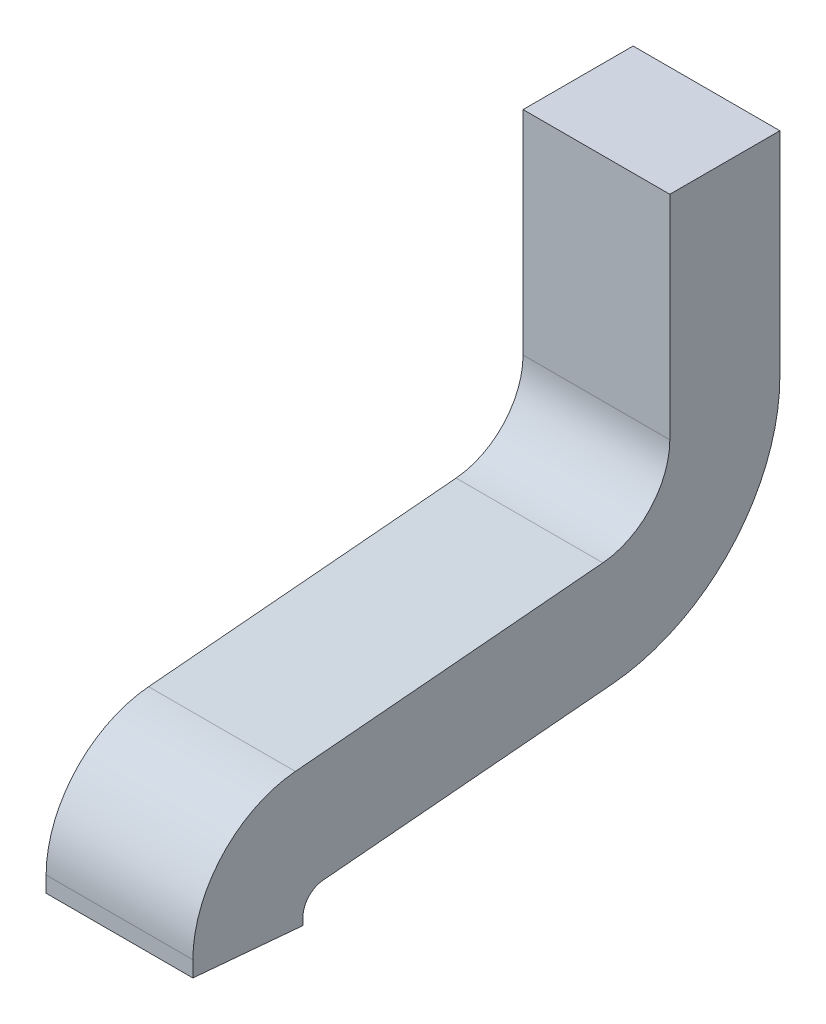
ISO-10303-21;
HEADER;
FILE_DESCRIPTION(('STEP AP214'),'2;1');
FILE_NAME('part.step','',(''),(''),'','','');
FILE_SCHEMA(('AUTOMOTIVE_DESIGN { 1 0 10303 214 1 1 1 1 }'));
ENDSEC;
DATA;
#1=APPLICATION_CONTEXT('core data for automotive mechanical design processes');
#2=APPLICATION_PROTOCOL_DEFINITION('international standard','automotive_design',2000,#1);
#3=PRODUCT_CONTEXT('',#1,'mechanical');
#4=PRODUCT('Part','Part','',(#3));
#5=PRODUCT_RELATED_PRODUCT_CATEGORY('part','',(#4));
#6=PRODUCT_DEFINITION_FORMATION('','',#4);
#7=PRODUCT_DEFINITION_CONTEXT('part definition',#1,'design');
#8=PRODUCT_DEFINITION('design','',#6,#7);
#9=PRODUCT_DEFINITION_SHAPE('','',#8);
#10=(LENGTH_UNIT() NAMED_UNIT(*) SI_UNIT(.MILLI.,.METRE.));
#11=(NAMED_UNIT(*) PLANE_ANGLE_UNIT() SI_UNIT($,.RADIAN.));
#12=(NAMED_UNIT(*) SI_UNIT($,.STERADIAN.) SOLID_ANGLE_UNIT());
#13=UNCERTAINTY_MEASURE_WITH_UNIT(LENGTH_MEASURE(1.E-05),#10,'distance_accuracy_value','');
#14=(GEOMETRIC_REPRESENTATION_CONTEXT(3) GLOBAL_UNCERTAINTY_ASSIGNED_CONTEXT((#13)) GLOBAL_UNIT_ASSIGNED_CONTEXT((#10,
#11,#12)) REPRESENTATION_CONTEXT('',''));
#15=CARTESIAN_POINT('',(0.,0.,0.));
#16=DIRECTION('',(0.,0.,1.));
#17=DIRECTION('',(1.,0.,0.));
#18=AXIS2_PLACEMENT_3D('',#15,#16,#17);
#19=CARTESIAN_POINT('',(-0.225,2.,0.15));
#20=DIRECTION('',(0.,1.,0.));
#21=DIRECTION('',(1.,0.,0.));
#22=AXIS2_PLACEMENT_3D('',#19,#20,#21);
#23=PLANE('',#22);
#24=DIRECTION('',(0.,0.,-1.));
#25=VECTOR('',#24,1.);
#26=CARTESIAN_POINT('',(-0.425,2.,0.15));
#27=LINE('',#26,#25);
#28=CARTESIAN_POINT('',(-0.425,2.,0.15));
#29=VERTEX_POINT('',#28);
#30=CARTESIAN_POINT('',(-0.425,2.,0.));
#31=VERTEX_POINT('',#30);
#32=EDGE_CURVE('E271',#29,#31,#27,.T.);
#33=ORIENTED_EDGE('',*,*,#32,.F.);
#34=DIRECTION('',(-1.,0.,0.));
#35=VECTOR('',#34,1.);
#36=CARTESIAN_POINT('',(-0.225,2.,0.15));
#37=LINE('',#36,#35);
#38=CARTESIAN_POINT('',(-0.225,2.,0.15));
#39=VERTEX_POINT('',#38);
#40=EDGE_CURVE('E11',#39,#29,#37,.T.);
#41=ORIENTED_EDGE('',*,*,#40,.F.);
#42=DIRECTION('',(0.,0.,-1.));
#43=VECTOR('',#42,1.);
#44=CARTESIAN_POINT('',(-0.225,2.,0.15));
#45=LINE('',#44,#43);
#46=CARTESIAN_POINT('',(-0.225,2.,0.));
#47=VERTEX_POINT('',#46);
#48=EDGE_CURVE('E221',#39,#47,#45,.T.);
#49=ORIENTED_EDGE('',*,*,#48,.T.);
#50=DIRECTION('',(-1.,0.,0.));
#51=VECTOR('',#50,1.);
#52=CARTESIAN_POINT('',(-0.225,2.,0.));
#53=LINE('',#52,#51);
#54=EDGE_CURVE('E230',#47,#31,#53,.T.);
#55=ORIENTED_EDGE('',*,*,#54,.T.);
#56=EDGE_LOOP('',(#33,#41,#49,#55));
#57=FACE_BOUND('',#56,.T.);
#58=ADVANCED_FACE('F17',(#57),#23,.T.);
#59=CARTESIAN_POINT('',(-0.225,2.,0.15));
#60=DIRECTION('',(0.,0.,-1.));
#61=DIRECTION('',(-1.,0.,0.));
#62=AXIS2_PLACEMENT_3D('',#59,#60,#61);
#63=PLANE('',#62);
#64=DIRECTION('',(0.,-1.,0.));
#65=VECTOR('',#64,1.);
#66=CARTESIAN_POINT('',(-0.425,2.,0.15));
#67=LINE('',#66,#65);
#68=CARTESIAN_POINT('',(-0.425,1.71026152399,0.15));
#69=VERTEX_POINT('',#68);
#70=EDGE_CURVE('E225',#29,#69,#67,.T.);
#71=ORIENTED_EDGE('',*,*,#70,.T.);
#72=DIRECTION('',(-1.,0.,0.));
#73=VECTOR('',#72,1.);
#74=CARTESIAN_POINT('',(-0.225,1.71026152399,0.15));
#75=LINE('',#74,#73);
#76=CARTESIAN_POINT('',(-0.225,1.71026152399,0.15));
#77=VERTEX_POINT('',#76);
#78=EDGE_CURVE('E28',#77,#69,#75,.T.);
#79=ORIENTED_EDGE('',*,*,#78,.F.);
#80=DIRECTION('',(0.,-1.,0.));
#81=VECTOR('',#80,1.);
#82=CARTESIAN_POINT('',(-0.225,2.,0.15));
#83=LINE('',#82,#81);
#84=EDGE_CURVE('E217',#39,#77,#83,.T.);
#85=ORIENTED_EDGE('',*,*,#84,.F.);
#86=ORIENTED_EDGE('',*,*,#40,.T.);
#87=EDGE_LOOP('',(#71,#79,#85,#86));
#88=FACE_BOUND('',#87,.T.);
#89=ADVANCED_FACE('F423',(#88),#63,.F.);
#90=CARTESIAN_POINT('',(-0.225,1.71026152399,0.25));
#91=DIRECTION('',(-1.,0.,0.));
#92=DIRECTION('',(0.,0.,1.));
#93=AXIS2_PLACEMENT_3D('',#90,#91,#92);
#94=CYLINDRICAL_SURFACE('',#93,0.1);
#95=CARTESIAN_POINT('',(-0.425,1.71026152399,0.25));
#96=DIRECTION('',(-1.,0.,0.));
#97=DIRECTION('',(0.,0.,1.));
#98=AXIS2_PLACEMENT_3D('',#95,#96,#97);
#99=CIRCLE('',#98,0.1);
#100=CARTESIAN_POINT('',(-0.425,1.610642054181,0.241284425725));
#101=VERTEX_POINT('',#100);
#102=EDGE_CURVE('E229',#69,#101,#99,.T.);
#103=ORIENTED_EDGE('',*,*,#102,.T.);
#104=DIRECTION('',(-1.,0.,0.));
#105=VECTOR('',#104,1.);
#106=CARTESIAN_POINT('',(-0.225,1.610642054181,0.241284425725));
#107=LINE('',#106,#105);
#108=CARTESIAN_POINT('',(-0.225,1.610642054181,0.241284425725));
#109=VERTEX_POINT('',#108);
#110=EDGE_CURVE('E212',#109,#101,#107,.T.);
#111=ORIENTED_EDGE('',*,*,#110,.F.);
#112=CARTESIAN_POINT('',(-0.225,1.71026152399,0.25));
#113=DIRECTION('',(-1.,0.,0.));
#114=DIRECTION('',(0.,0.,1.));
#115=AXIS2_PLACEMENT_3D('',#112,#113,#114);
#116=CIRCLE('',#115,0.1);
#117=EDGE_CURVE('E211',#77,#109,#116,.T.);
#118=ORIENTED_EDGE('',*,*,#117,.F.);
#119=ORIENTED_EDGE('',*,*,#78,.T.);
#120=EDGE_LOOP('',(#103,#111,#118,#119));
#121=FACE_BOUND('',#120,.T.);
#122=ADVANCED_FACE('F365',(#121),#94,.F.);
#123=CARTESIAN_POINT('',(-0.225,1.573979894479,0.66033482864));
#124=DIRECTION('',(0.,0.996194698091747,0.0871557427476379));
#125=DIRECTION('',(1.,0.,0.));
#126=AXIS2_PLACEMENT_3D('',#123,#124,#125);
#127=PLANE('',#126);
#128=DIRECTION('',(0.,0.0871557427476379,-0.996194698091747));
#129=VECTOR('',#128,1.);
#130=CARTESIAN_POINT('',(-0.425,1.573979894479,0.66033482864));
#131=LINE('',#130,#129);
#132=CARTESIAN_POINT('',(-0.425,1.573979894479,0.66033482864));
#133=VERTEX_POINT('',#132);
#134=EDGE_CURVE('E192',#133,#101,#131,.T.);
#135=ORIENTED_EDGE('',*,*,#134,.F.);
#136=DIRECTION('',(-1.,0.,0.));
#137=VECTOR('',#136,1.);
#138=CARTESIAN_POINT('',(-0.225,1.573979894479,0.66033482864));
#139=LINE('',#138,#137);
#140=CARTESIAN_POINT('',(-0.225,1.573979894479,0.66033482864));
#141=VERTEX_POINT('',#140);
#142=EDGE_CURVE('E59',#141,#133,#139,.T.);
#143=ORIENTED_EDGE('',*,*,#142,.F.);
#144=DIRECTION('',(0.,0.0871557427476379,-0.996194698091747));
#145=VECTOR('',#144,1.);
#146=CARTESIAN_POINT('',(-0.225,1.573979894479,0.66033482864));
#147=LINE('',#146,#145);
#148=EDGE_CURVE('E207',#141,#109,#147,.T.);
#149=ORIENTED_EDGE('',*,*,#148,.T.);
#150=ORIENTED_EDGE('',*,*,#110,.T.);
#151=EDGE_LOOP('',(#135,#143,#149,#150));
#152=FACE_BOUND('',#151,.T.);
#153=ADVANCED_FACE('F354',(#152),#127,.T.);
#154=CARTESIAN_POINT('',(-0.225,1.421562105671,0.647));
#155=DIRECTION('',(-1.,0.,0.));
#156=DIRECTION('',(0.,0.,1.));
#157=AXIS2_PLACEMENT_3D('',#154,#155,#156);
#158=CYLINDRICAL_SURFACE('',#157,0.153);
#159=CARTESIAN_POINT('',(-0.425,1.421562105671,0.647));
#160=DIRECTION('',(1.,0.,0.));
#161=DIRECTION('',(0.,0.,-1.));
#162=AXIS2_PLACEMENT_3D('',#159,#160,#161);
#163=CIRCLE('',#162,0.153);
#164=CARTESIAN_POINT('',(-0.425,1.421562105671,0.8));
#165=VERTEX_POINT('',#164);
#166=EDGE_CURVE('E189',#133,#165,#163,.T.);
#167=ORIENTED_EDGE('',*,*,#166,.T.);
#168=DIRECTION('',(-1.,0.,0.));
#169=VECTOR('',#168,1.);
#170=CARTESIAN_POINT('',(-0.225,1.421562105671,0.8));
#171=LINE('',#170,#169);
#172=CARTESIAN_POINT('',(-0.225,1.421562105671,0.8));
#173=VERTEX_POINT('',#172);
#174=EDGE_CURVE('E72',#173,#165,#171,.T.);
#175=ORIENTED_EDGE('',*,*,#174,.F.);
#176=CARTESIAN_POINT('',(-0.225,1.421562105671,0.647));
#177=DIRECTION('',(1.,0.,0.));
#178=DIRECTION('',(0.,0.,-1.));
#179=AXIS2_PLACEMENT_3D('',#176,#177,#178);
#180=CIRCLE('',#179,0.153);
#181=EDGE_CURVE('E176',#141,#173,#180,.T.);
#182=ORIENTED_EDGE('',*,*,#181,.F.);
#183=ORIENTED_EDGE('',*,*,#142,.T.);
#184=EDGE_LOOP('',(#167,#175,#182,#183));
#185=FACE_BOUND('',#184,.T.);
#186=ADVANCED_FACE('F348',(#185),#158,.T.);
#187=CARTESIAN_POINT('',(-0.225,1.4,0.8));
#188=DIRECTION('',(0.,0.,1.));
#189=DIRECTION('',(1.,0.,0.));
#190=AXIS2_PLACEMENT_3D('',#187,#188,#189);
#191=PLANE('',#190);
#192=DIRECTION('',(0.,1.,0.));
#193=VECTOR('',#192,1.);
#194=CARTESIAN_POINT('',(-0.425,1.4,0.8));
#195=LINE('',#194,#193);
#196=CARTESIAN_POINT('',(-0.425,1.4,0.8));
#197=VERTEX_POINT('',#196);
#198=EDGE_CURVE('E193',#197,#165,#195,.T.);
#199=ORIENTED_EDGE('',*,*,#198,.F.);
#200=DIRECTION('',(-1.,0.,0.));
#201=VECTOR('',#200,1.);
#202=CARTESIAN_POINT('',(-0.225,1.4,0.8));
#203=LINE('',#202,#201);
#204=CARTESIAN_POINT('',(-0.225,1.4,0.8));
#205=VERTEX_POINT('',#204);
#206=EDGE_CURVE('E82',#205,#197,#203,.T.);
#207=ORIENTED_EDGE('',*,*,#206,.F.);
#208=DIRECTION('',(0.,1.,0.));
#209=VECTOR('',#208,1.);
#210=CARTESIAN_POINT('',(-0.225,1.4,0.8));
#211=LINE('',#210,#209);
#212=EDGE_CURVE('E169',#205,#173,#211,.T.);
#213=ORIENTED_EDGE('',*,*,#212,.T.);
#214=ORIENTED_EDGE('',*,*,#174,.T.);
#215=EDGE_LOOP('',(#199,#207,#213,#214));
#216=FACE_BOUND('',#215,.T.);
#217=ADVANCED_FACE('F353',(#216),#191,.T.);
#218=CARTESIAN_POINT('',(-0.225,1.4,0.8));
#219=DIRECTION('',(0.,0.996194698091747,-0.0871557427476379));
#220=DIRECTION('',(-1.,0.,0.));
#221=AXIS2_PLACEMENT_3D('',#218,#219,#220);
#222=PLANE('',#221);
#223=DIRECTION('',(0.,-0.0871557427476379,-0.996194698091747));
#224=VECTOR('',#223,1.);
#225=CARTESIAN_POINT('',(-0.425,1.4,0.8));
#226=LINE('',#225,#224);
#227=CARTESIAN_POINT('',(-0.425,1.386876700471,0.65));
#228=VERTEX_POINT('',#227);
#229=EDGE_CURVE('E156',#197,#228,#226,.T.);
#230=ORIENTED_EDGE('',*,*,#229,.T.);
#231=DIRECTION('',(-1.,0.,0.));
#232=VECTOR('',#231,1.);
#233=CARTESIAN_POINT('',(-0.225,1.386876700471,0.65));
#234=LINE('',#233,#232);
#235=CARTESIAN_POINT('',(-0.225,1.386876700471,0.65));
#236=VERTEX_POINT('',#235);
#237=EDGE_CURVE('E150',#236,#228,#234,.T.);
#238=ORIENTED_EDGE('',*,*,#237,.F.);
#239=DIRECTION('',(0.,-0.0871557427476379,-0.996194698091747));
#240=VECTOR('',#239,1.);
#241=CARTESIAN_POINT('',(-0.225,1.4,0.8));
#242=LINE('',#241,#240);
#243=EDGE_CURVE('E153',#205,#236,#242,.T.);
#244=ORIENTED_EDGE('',*,*,#243,.F.);
#245=ORIENTED_EDGE('',*,*,#206,.T.);
#246=EDGE_LOOP('',(#230,#238,#244,#245));
#247=FACE_BOUND('',#246,.T.);
#248=ADVANCED_FACE('F151',(#247),#222,.F.);
#249=CARTESIAN_POINT('',(-0.225,1.396821163973,0.65));
#250=DIRECTION('',(0.,0.,-1.));
#251=DIRECTION('',(0.,-1.,0.));
#252=AXIS2_PLACEMENT_3D('',#249,#250,#251);
#253=PLANE('',#252);
#254=DIRECTION('',(0.,-1.,0.));
#255=VECTOR('',#254,1.);
#256=CARTESIAN_POINT('',(-0.425,1.396821163973,0.65));
#257=LINE('',#256,#255);
#258=CARTESIAN_POINT('',(-0.425,1.396821163973,0.65));
#259=VERTEX_POINT('',#258);
#260=EDGE_CURVE('E180',#259,#228,#257,.T.);
#261=ORIENTED_EDGE('',*,*,#260,.F.);
#262=DIRECTION('',(-1.,0.,0.));
#263=VECTOR('',#262,1.);
#264=CARTESIAN_POINT('',(-0.225,1.396821163973,0.65));
#265=LINE('',#264,#263);
#266=CARTESIAN_POINT('',(-0.225,1.396821163973,0.65));
#267=VERTEX_POINT('',#266);
#268=EDGE_CURVE('E145',#267,#259,#265,.T.);
#269=ORIENTED_EDGE('',*,*,#268,.F.);
#270=DIRECTION('',(0.,-1.,0.));
#271=VECTOR('',#270,1.);
#272=CARTESIAN_POINT('',(-0.225,1.396821163973,0.65));
#273=LINE('',#272,#271);
#274=EDGE_CURVE('E21',#267,#236,#273,.T.);
#275=ORIENTED_EDGE('',*,*,#274,.T.);
#276=ORIENTED_EDGE('',*,*,#237,.T.);
#277=EDGE_LOOP('',(#261,#269,#275,#276));
#278=FACE_BOUND('',#277,.T.);
#279=ADVANCED_FACE('F161',(#278),#253,.T.);
#280=CARTESIAN_POINT('',(-0.225,1.396821163973,0.62));
#281=DIRECTION('',(-1.,0.,0.));
#282=DIRECTION('',(0.,0.,1.));
#283=AXIS2_PLACEMENT_3D('',#280,#281,#282);
#284=CYLINDRICAL_SURFACE('',#283,0.03);
#285=CARTESIAN_POINT('',(-0.425,1.396821163973,0.62));
#286=DIRECTION('',(1.,0.,0.));
#287=DIRECTION('',(0.,0.,-1.));
#288=AXIS2_PLACEMENT_3D('',#285,#286,#287);
#289=CIRCLE('',#288,0.03);
#290=CARTESIAN_POINT('',(-0.425,1.426707004916,0.622614672282));
#291=VERTEX_POINT('',#290);
#292=EDGE_CURVE('E248',#291,#259,#289,.T.);
#293=ORIENTED_EDGE('',*,*,#292,.F.);
#294=DIRECTION('',(-1.,0.,0.));
#295=VECTOR('',#294,1.);
#296=CARTESIAN_POINT('',(-0.225,1.426707004916,0.622614672282));
#297=LINE('',#296,#295);
#298=CARTESIAN_POINT('',(-0.225,1.426707004916,0.622614672282));
#299=VERTEX_POINT('',#298);
#300=EDGE_CURVE('E201',#299,#291,#297,.T.);
#301=ORIENTED_EDGE('',*,*,#300,.F.);
#302=CARTESIAN_POINT('',(-0.225,1.396821163973,0.62));
#303=DIRECTION('',(1.,0.,0.));
#304=DIRECTION('',(0.,0.,-1.));
#305=AXIS2_PLACEMENT_3D('',#302,#303,#304);
#306=CIRCLE('',#305,0.03);
#307=EDGE_CURVE('E165',#299,#267,#306,.T.);
#308=ORIENTED_EDGE('',*,*,#307,.T.);
#309=ORIENTED_EDGE('',*,*,#268,.T.);
#310=EDGE_LOOP('',(#293,#301,#308,#309));
#311=FACE_BOUND('',#310,.T.);
#312=ADVANCED_FACE('F376',(#311),#284,.F.);
#313=CARTESIAN_POINT('',(-0.225,1.461212849467,0.228211064313));
#314=DIRECTION('',(0.,-0.996194698091747,-0.0871557427476379));
#315=DIRECTION('',(0.,0.0871557427476379,-0.996194698091747));
#316=AXIS2_PLACEMENT_3D('',#313,#314,#315);
#317=PLANE('',#316);
#318=DIRECTION('',(0.,-0.0871557427476379,0.996194698091747));
#319=VECTOR('',#318,1.);
#320=CARTESIAN_POINT('',(-0.425,1.461212849467,0.228211064313));
#321=LINE('',#320,#319);
#322=CARTESIAN_POINT('',(-0.425,1.461212849467,0.228211064313));
#323=VERTEX_POINT('',#322);
#324=EDGE_CURVE('E243',#323,#291,#321,.T.);
#325=ORIENTED_EDGE('',*,*,#324,.F.);
#326=DIRECTION('',(-1.,0.,0.));
#327=VECTOR('',#326,1.);
#328=CARTESIAN_POINT('',(-0.225,1.461212849467,0.228211064313));
#329=LINE('',#328,#327);
#330=CARTESIAN_POINT('',(-0.225,1.461212849467,0.228211064313));
#331=VERTEX_POINT('',#330);
#332=EDGE_CURVE('E203',#331,#323,#329,.T.);
#333=ORIENTED_EDGE('',*,*,#332,.F.);
#334=DIRECTION('',(0.,-0.0871557427476379,0.996194698091747));
#335=VECTOR('',#334,1.);
#336=CARTESIAN_POINT('',(-0.225,1.461212849467,0.228211064313));
#337=LINE('',#336,#335);
#338=EDGE_CURVE('E184',#331,#299,#337,.T.);
#339=ORIENTED_EDGE('',*,*,#338,.T.);
#340=ORIENTED_EDGE('',*,*,#300,.T.);
#341=EDGE_LOOP('',(#325,#333,#339,#340));
#342=FACE_BOUND('',#341,.T.);
#343=ADVANCED_FACE('F291',(#342),#317,.T.);
#344=CARTESIAN_POINT('',(-0.225,1.71026152399,0.25));
#345=DIRECTION('',(-1.,0.,0.));
#346=DIRECTION('',(0.,0.,1.));
#347=AXIS2_PLACEMENT_3D('',#344,#345,#346);
#348=CYLINDRICAL_SURFACE('',#347,0.25);
#349=CARTESIAN_POINT('',(-0.425,1.71026152399,0.25));
#350=DIRECTION('',(1.,0.,0.));
#351=DIRECTION('',(0.,0.,-1.));
#352=AXIS2_PLACEMENT_3D('',#349,#350,#351);
#353=CIRCLE('',#352,0.25);
#354=CARTESIAN_POINT('',(-0.425,1.71026152399,0.));
#355=VERTEX_POINT('',#354);
#356=EDGE_CURVE('E240',#323,#355,#353,.T.);
#357=ORIENTED_EDGE('',*,*,#356,.T.);
#358=DIRECTION('',(-1.,0.,0.));
#359=VECTOR('',#358,1.);
#360=CARTESIAN_POINT('',(-0.225,1.71026152399,0.));
#361=LINE('',#360,#359);
#362=CARTESIAN_POINT('',(-0.225,1.71026152399,0.));
#363=VERTEX_POINT('',#362);
#364=EDGE_CURVE('E42',#363,#355,#361,.T.);
#365=ORIENTED_EDGE('',*,*,#364,.F.);
#366=CARTESIAN_POINT('',(-0.225,1.71026152399,0.25));
#367=DIRECTION('',(1.,0.,0.));
#368=DIRECTION('',(0.,0.,-1.));
#369=AXIS2_PLACEMENT_3D('',#366,#367,#368);
#370=CIRCLE('',#369,0.25);
#371=EDGE_CURVE('E187',#331,#363,#370,.T.);
#372=ORIENTED_EDGE('',*,*,#371,.F.);
#373=ORIENTED_EDGE('',*,*,#332,.T.);
#374=EDGE_LOOP('',(#357,#365,#372,#373));
#375=FACE_BOUND('',#374,.T.);
#376=ADVANCED_FACE('F287',(#375),#348,.T.);
#377=CARTESIAN_POINT('',(-0.225,2.,0.));
#378=DIRECTION('',(0.,0.,-1.));
#379=DIRECTION('',(-1.,0.,0.));
#380=AXIS2_PLACEMENT_3D('',#377,#378,#379);
#381=PLANE('',#380);
#382=DIRECTION('',(0.,-1.,0.));
#383=VECTOR('',#382,1.);
#384=CARTESIAN_POINT('',(-0.425,2.,0.));
#385=LINE('',#384,#383);
#386=EDGE_CURVE('E244',#31,#355,#385,.T.);
#387=ORIENTED_EDGE('',*,*,#386,.F.);
#388=ORIENTED_EDGE('',*,*,#54,.F.);
#389=DIRECTION('',(0.,-1.,0.));
#390=VECTOR('',#389,1.);
#391=CARTESIAN_POINT('',(-0.225,2.,0.));
#392=LINE('',#391,#390);
#393=EDGE_CURVE('E197',#47,#363,#392,.T.);
#394=ORIENTED_EDGE('',*,*,#393,.T.);
#395=ORIENTED_EDGE('',*,*,#364,.T.);
#396=EDGE_LOOP('',(#387,#388,#394,#395));
#397=FACE_BOUND('',#396,.T.);
#398=ADVANCED_FACE('F19',(#397),#381,.T.);
#399=CARTESIAN_POINT('',(-0.225,1.71026152399,0.25));
#400=DIRECTION('',(1.,0.,0.));
#401=DIRECTION('',(0.,1.,0.));
#402=AXIS2_PLACEMENT_3D('',#399,#400,#401);
#403=PLANE('',#402);
#404=ORIENTED_EDGE('',*,*,#48,.F.);
#405=ORIENTED_EDGE('',*,*,#84,.T.);
#406=ORIENTED_EDGE('',*,*,#117,.T.);
#407=ORIENTED_EDGE('',*,*,#148,.F.);
#408=ORIENTED_EDGE('',*,*,#181,.T.);
#409=ORIENTED_EDGE('',*,*,#212,.F.);
#410=ORIENTED_EDGE('',*,*,#243,.T.);
#411=ORIENTED_EDGE('',*,*,#274,.F.);
#412=ORIENTED_EDGE('',*,*,#307,.F.);
#413=ORIENTED_EDGE('',*,*,#338,.F.);
#414=ORIENTED_EDGE('',*,*,#371,.T.);
#415=ORIENTED_EDGE('',*,*,#393,.F.);
#416=EDGE_LOOP('',(#404,#405,#406,#407,#408,#409,#410,#411,#412,#413,#414,#415));
#417=FACE_BOUND('',#416,.T.);
#418=ADVANCED_FACE('F167',(#417),#403,.T.);
#419=CARTESIAN_POINT('',(-0.425,1.71026152399,0.25));
#420=DIRECTION('',(1.,0.,0.));
#421=DIRECTION('',(0.,1.,0.));
#422=AXIS2_PLACEMENT_3D('',#419,#420,#421);
#423=PLANE('',#422);
#424=ORIENTED_EDGE('',*,*,#32,.T.);
#425=ORIENTED_EDGE('',*,*,#386,.T.);
#426=ORIENTED_EDGE('',*,*,#356,.F.);
#427=ORIENTED_EDGE('',*,*,#324,.T.);
#428=ORIENTED_EDGE('',*,*,#292,.T.);
#429=ORIENTED_EDGE('',*,*,#260,.T.);
#430=ORIENTED_EDGE('',*,*,#229,.F.);
#431=ORIENTED_EDGE('',*,*,#198,.T.);
#432=ORIENTED_EDGE('',*,*,#166,.F.);
#433=ORIENTED_EDGE('',*,*,#134,.T.);
#434=ORIENTED_EDGE('',*,*,#102,.F.);
#435=ORIENTED_EDGE('',*,*,#70,.F.);
#436=EDGE_LOOP('',(#424,#425,#426,#427,#428,#429,#430,#431,#432,#433,#434,#435));
#437=FACE_BOUND('',#436,.T.);
#438=ADVANCED_FACE('F293',(#437),#423,.F.);
#439=CLOSED_SHELL('',(#58,#89,#122,#153,#186,#217,#248,#279,#312,#343,#376,#398,#418,#438));
#440=MANIFOLD_SOLID_BREP('B1',#439);
#441=ADVANCED_BREP_SHAPE_REPRESENTATION('',(#18,#440),#14);
#442=SHAPE_DEFINITION_REPRESENTATION(#9,#441);
ENDSEC;
END-ISO-10303-21;
